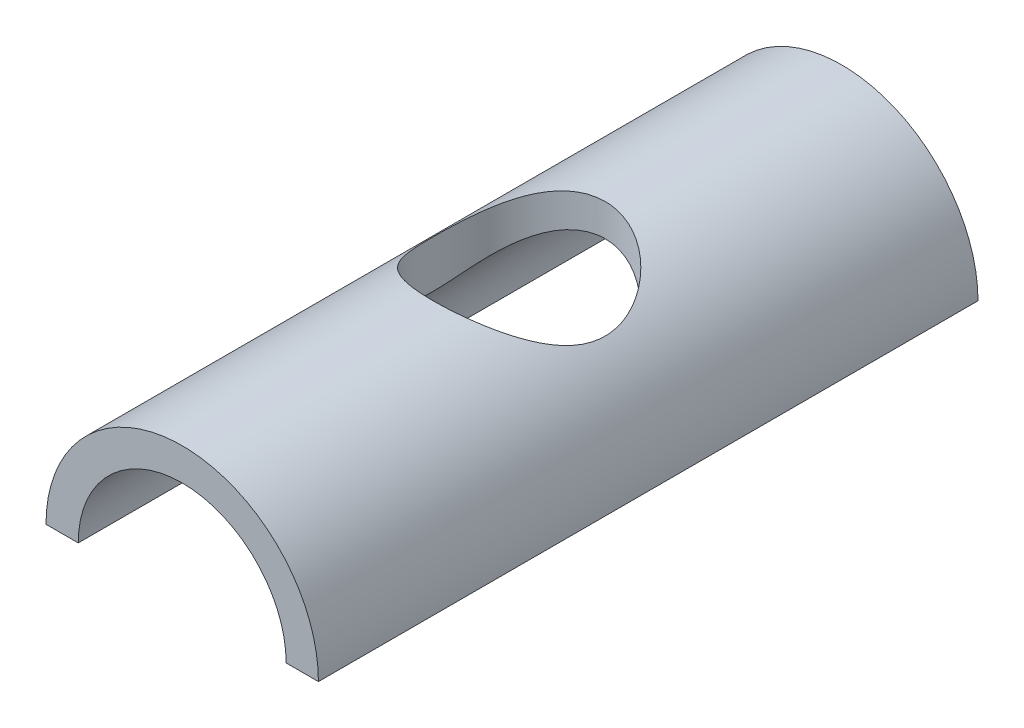
ISO-10303-21;
HEADER;
FILE_DESCRIPTION(('STEP AP214'),'2;1');
FILE_NAME('part.step','',(''),(''),'','','');
FILE_SCHEMA(('AUTOMOTIVE_DESIGN { 1 0 10303 214 1 1 1 1 }'));
ENDSEC;
DATA;
#1=APPLICATION_CONTEXT('core data for automotive mechanical design processes');
#2=APPLICATION_PROTOCOL_DEFINITION('international standard','automotive_design',2000,#1);
#3=PRODUCT_CONTEXT('',#1,'mechanical');
#4=PRODUCT('Part','Part','',(#3));
#5=PRODUCT_RELATED_PRODUCT_CATEGORY('part','',(#4));
#6=PRODUCT_DEFINITION_FORMATION('','',#4);
#7=PRODUCT_DEFINITION_CONTEXT('part definition',#1,'design');
#8=PRODUCT_DEFINITION('design','',#6,#7);
#9=PRODUCT_DEFINITION_SHAPE('','',#8);
#10=(LENGTH_UNIT() NAMED_UNIT(*) SI_UNIT(.MILLI.,.METRE.));
#11=(NAMED_UNIT(*) PLANE_ANGLE_UNIT() SI_UNIT($,.RADIAN.));
#12=(NAMED_UNIT(*) SI_UNIT($,.STERADIAN.) SOLID_ANGLE_UNIT());
#13=UNCERTAINTY_MEASURE_WITH_UNIT(LENGTH_MEASURE(1.E-05),#10,'distance_accuracy_value','');
#14=(GEOMETRIC_REPRESENTATION_CONTEXT(3) GLOBAL_UNCERTAINTY_ASSIGNED_CONTEXT((#13)) GLOBAL_UNIT_ASSIGNED_CONTEXT((#10,
#11,#12)) REPRESENTATION_CONTEXT('',''));
#15=CARTESIAN_POINT('',(0.,0.,0.));
#16=DIRECTION('',(0.,0.,1.));
#17=DIRECTION('',(1.,0.,0.));
#18=AXIS2_PLACEMENT_3D('',#15,#16,#17);
#19=CARTESIAN_POINT('',(0.,0.,46.));
#20=DIRECTION('',(0.,0.,-1.));
#21=DIRECTION('',(-1.,0.,0.));
#22=AXIS2_PLACEMENT_3D('',#19,#20,#21);
#23=CYLINDRICAL_SURFACE('',#22,7.25);
#24=CARTESIAN_POINT('',(0.,0.,0.));
#25=DIRECTION('',(0.,0.,-1.));
#26=DIRECTION('',(1.,0.,0.));
#27=AXIS2_PLACEMENT_3D('',#24,#25,#26);
#28=CIRCLE('',#27,7.25);
#29=CARTESIAN_POINT('',(-7.25,0.,0.));
#30=VERTEX_POINT('',#29);
#31=CARTESIAN_POINT('',(7.25,0.,0.));
#32=VERTEX_POINT('',#31);
#33=EDGE_CURVE('E104',#30,#32,#28,.T.);
#34=ORIENTED_EDGE('',*,*,#33,.T.);
#35=DIRECTION('',(0.,0.,-1.));
#36=VECTOR('',#35,1.);
#37=CARTESIAN_POINT('',(7.25,0.,46.));
#38=LINE('',#37,#36);
#39=CARTESIAN_POINT('',(7.25,0.,46.));
#40=VERTEX_POINT('',#39);
#41=EDGE_CURVE('E11',#40,#32,#38,.T.);
#42=ORIENTED_EDGE('',*,*,#41,.F.);
#43=CARTESIAN_POINT('',(0.,0.,46.));
#44=DIRECTION('',(0.,0.,-1.));
#45=DIRECTION('',(1.,0.,0.));
#46=AXIS2_PLACEMENT_3D('',#43,#44,#45);
#47=CIRCLE('',#46,7.25);
#48=CARTESIAN_POINT('',(-7.25,0.,46.));
#49=VERTEX_POINT('',#48);
#50=EDGE_CURVE('E90',#49,#40,#47,.T.);
#51=ORIENTED_EDGE('',*,*,#50,.F.);
#52=DIRECTION('',(0.,0.,-1.));
#53=VECTOR('',#52,1.);
#54=CARTESIAN_POINT('',(-7.25,0.,46.));
#55=LINE('',#54,#53);
#56=EDGE_CURVE('E100',#49,#30,#55,.T.);
#57=ORIENTED_EDGE('',*,*,#56,.T.);
#58=EDGE_LOOP('',(#34,#42,#51,#57));
#59=FACE_BOUND('',#58,.T.);
#60=CARTESIAN_POINT('',(0.,7.25000000000001,16.5));
#61=CARTESIAN_POINT('',(0.142794907219309,7.25000294307049,16.4999970011492));
#62=CARTESIAN_POINT('',(0.285560513284474,7.24577461504276,16.5051037722168));
#63=CARTESIAN_POINT('',(0.569923491512396,7.22896707908606,16.5254289417004));
#64=CARTESIAN_POINT('',(0.711520546177624,7.21638567263639,16.5406500021868));
#65=CARTESIAN_POINT('',(0.992444124498384,7.18314572496627,16.5809450353406));
#66=CARTESIAN_POINT('',(1.1317688212589,7.16248098919067,16.6060265645256));
#67=CARTESIAN_POINT('',(1.40707325856606,7.11352268485923,16.6656197189015));
#68=CARTESIAN_POINT('',(1.54305146346756,7.08522568268542,16.7001355885247));
#69=CARTESIAN_POINT('',(1.80984306531895,7.02179736193545,16.7777943201452));
#70=CARTESIAN_POINT('',(1.9406848932974,6.98671295450233,16.820878019664));
#71=CARTESIAN_POINT('',(2.19750721614162,6.91024232689923,16.9152254037257));
#72=CARTESIAN_POINT('',(2.32348556053077,6.86885335816671,16.9664926564739));
#73=CARTESIAN_POINT('',(2.69324442383707,6.73627033083415,17.1316492812857));
#74=CARTESIAN_POINT('',(2.9290568973433,6.63660902289273,17.2569554058607));
#75=CARTESIAN_POINT('',(3.30527923983956,6.45495845722035,17.489269483862));
#76=CARTESIAN_POINT('',(3.45222274453993,6.37739247639391,17.589472029306));
#77=CARTESIAN_POINT('',(3.73462159167594,6.21622767385335,17.8006752929014));
#78=CARTESIAN_POINT('',(3.87007713631538,6.13262895837156,17.9116758209195));
#79=CARTESIAN_POINT('',(4.1296663876781,5.9609273348714,18.1438228574984));
#80=CARTESIAN_POINT('',(4.25376821433977,5.87281276624517,18.2649962071789));
#81=CARTESIAN_POINT('',(4.49020939386879,5.69407340035859,18.5165577360546));
#82=CARTESIAN_POINT('',(4.60255020453378,5.6034489159716,18.6469447698344));
#83=CARTESIAN_POINT('',(4.81736943709263,5.41994076452731,18.9190035986399));
#84=CARTESIAN_POINT('',(4.91963493747411,5.32704572280339,19.0608357991289));
#85=CARTESIAN_POINT('',(5.11187916811156,5.14285039696008,19.3536706915438));
#86=CARTESIAN_POINT('',(5.20185379926576,5.0515506536955,19.5046764187736));
#87=CARTESIAN_POINT('',(5.36894352453074,4.87358128949922,19.8156894235393));
#88=CARTESIAN_POINT('',(5.44608975948297,4.78690081384825,19.975673603509));
#89=CARTESIAN_POINT('',(5.58704839739933,4.62159866414672,20.3052308916291));
#90=CARTESIAN_POINT('',(5.65087222980053,4.54297011201253,20.4747956204812));
#91=CARTESIAN_POINT('',(5.76997492366783,4.39091705715482,20.8421905047063));
#92=CARTESIAN_POINT('',(5.82369474194907,4.31886452186471,21.0411325314577));
#93=CARTESIAN_POINT('',(5.889245827118,4.22855517734237,21.3477433974651));
#94=CARTESIAN_POINT('',(5.90858336890369,4.20142605004214,21.4512402334435));
#95=CARTESIAN_POINT('',(5.94194245848636,4.15411328772341,21.6606290433749));
#96=CARTESIAN_POINT('',(5.95596678737267,4.1339260196474,21.7665197334711));
#97=CARTESIAN_POINT('',(5.97853364458282,4.10122422933912,21.9814015704439));
#98=CARTESIAN_POINT('',(5.9870077072378,4.08880561872641,22.0904147370007));
#99=CARTESIAN_POINT('',(5.99797295167566,4.07270396167932,22.3093864574212));
#100=CARTESIAN_POINT('',(6.00046463603913,4.0690201814307,22.4193449310906));
#101=CARTESIAN_POINT('',(5.9993926158273,4.07060056739843,22.6391865568844));
#102=CARTESIAN_POINT('',(5.9958278654552,4.07586627897121,22.749069692722));
#103=CARTESIAN_POINT('',(5.98274535307967,4.09504454336989,22.9677173397539));
#104=CARTESIAN_POINT('',(5.9732268324475,4.10895819811432,23.0764817065994));
#105=CARTESIAN_POINT('',(5.94727629612498,4.14644057480787,23.3025458073524));
#106=CARTESIAN_POINT('',(5.93026056238181,4.17081858816861,23.4196434530612));
#107=CARTESIAN_POINT('',(5.88979007518596,4.22777670784383,23.6507195474228));
#108=CARTESIAN_POINT('',(5.8663307040542,4.26036269481234,23.7646956944676));
#109=CARTESIAN_POINT('',(5.78686263934216,4.36836987730036,24.1017437255455));
#110=CARTESIAN_POINT('',(5.72181876108843,4.45395521723485,24.3194833464426));
#111=CARTESIAN_POINT('',(5.58691462906194,4.62146110514997,24.6948374370364));
#112=CARTESIAN_POINT('',(5.52102738133079,4.70028322186784,24.8553838032628));
#113=CARTESIAN_POINT('',(5.37709008025812,4.86428868883377,25.1676666423427));
#114=CARTESIAN_POINT('',(5.29903316322641,4.9494756146259,25.3193980768813));
#115=CARTESIAN_POINT('',(5.13119048116541,5.12328144545739,25.6144400404513));
#116=CARTESIAN_POINT('',(5.04138927273291,5.21190475936464,25.7577391149824));
#117=CARTESIAN_POINT('',(4.85038989644595,5.39010943006203,26.0358390934517));
#118=CARTESIAN_POINT('',(4.74919394305476,5.47969059765005,26.1706416406959));
#119=CARTESIAN_POINT('',(4.53044911262027,5.66204480584741,26.4377936447494));
#120=CARTESIAN_POINT('',(4.41235537542636,5.7547701212834,26.5697304371424));
#121=CARTESIAN_POINT('',(4.16374710634584,5.93712733918325,26.8237471628069));
#122=CARTESIAN_POINT('',(4.03323071252882,6.02675877517882,26.9458256134077));
#123=CARTESIAN_POINT('',(3.76011124224012,6.20082566587056,27.1790755545607));
#124=CARTESIAN_POINT('',(3.61753254819215,6.28527103382954,27.2902681119387));
#125=CARTESIAN_POINT('',(3.32028036446648,6.44723665334579,27.5008887148604));
#126=CARTESIAN_POINT('',(3.16561132035696,6.52475942805639,27.6003210511039));
#127=CARTESIAN_POINT('',(2.88575412835175,6.65222838738494,27.7622668158398));
#128=CARTESIAN_POINT('',(2.76315650161921,6.70415334424071,27.8277147380705));
#129=CARTESIAN_POINT('',(2.51186919229084,6.80229341030455,27.9506944178697));
#130=CARTESIAN_POINT('',(2.38318098150162,6.84850988933583,28.0082280749469));
#131=CARTESIAN_POINT('',(2.12020181480439,6.93443404114119,28.1147006487041));
#132=CARTESIAN_POINT('',(1.98591156475637,6.97414253083648,28.1636406441663));
#133=CARTESIAN_POINT('',(1.71245903428013,7.04627311640666,28.252227913297));
#134=CARTESIAN_POINT('',(1.57329919602248,7.07869880585775,28.2918797704587));
#135=CARTESIAN_POINT('',(1.28986329626486,7.13581144443918,28.3615446912051));
#136=CARTESIAN_POINT('',(1.14555660928916,7.16043830733639,28.3914829575416));
#137=CARTESIAN_POINT('',(0.853934464569178,7.20103917395386,28.4407626216202));
#138=CARTESIAN_POINT('',(0.706619003341277,7.21701316765509,28.4601040070925));
#139=CARTESIAN_POINT('',(0.41032075829055,7.23990370963764,28.4878014825216));
#140=CARTESIAN_POINT('',(0.261338729891754,7.24682420628183,28.4961623612447));
#141=CARTESIAN_POINT('',(-0.0369693893814371,7.25143977255814,28.5017398887338));
#142=CARTESIAN_POINT('',(-0.18629544598704,7.24913572444478,28.4989576032549));
#143=CARTESIAN_POINT('',(-0.467119805203322,7.23614395394476,28.4832512090834));
#144=CARTESIAN_POINT('',(-0.598731790334349,7.2264297011182,28.471504654499));
#145=CARTESIAN_POINT('',(-0.860241375050885,7.19998348111864,28.4394733617939));
#146=CARTESIAN_POINT('',(-0.990138397589092,7.18324921096307,28.419185821715));
#147=CARTESIAN_POINT('',(-1.2472810793257,7.14308856572792,28.370383894376));
#148=CARTESIAN_POINT('',(-1.37452752418311,7.11966420484047,28.3418719832097));
#149=CARTESIAN_POINT('',(-1.62569245341891,7.06655023411578,28.2770212560408));
#150=CARTESIAN_POINT('',(-1.74960965298127,7.03685824355244,28.2406794657911));
#151=CARTESIAN_POINT('',(-2.12094617777228,6.93762003159037,28.1187511653766));
#152=CARTESIAN_POINT('',(-2.36216393746343,6.85884080398107,28.0213783598909));
#153=CARTESIAN_POINT('',(-2.82417477936797,6.68190846734848,27.799984347027));
#154=CARTESIAN_POINT('',(-3.04496092185272,6.58374881085456,27.6759541324703));
#155=CARTESIAN_POINT('',(-3.40697573478949,6.40188237956942,27.4422062177174));
#156=CARTESIAN_POINT('',(-3.55344910928525,6.32156431861596,27.3378504386004));
#157=CARTESIAN_POINT('',(-3.83448747456273,6.15514971323948,27.1182794798088));
#158=CARTESIAN_POINT('',(-3.9690520631839,6.06905297384261,27.0030639336701));
#159=CARTESIAN_POINT('',(-4.22657914363382,5.89262037945056,26.7623014054474));
#160=CARTESIAN_POINT('',(-4.34950133845351,5.80227131312427,26.6367211673583));
#161=CARTESIAN_POINT('',(-4.58320461296234,5.61949581764139,26.3761911861721));
#162=CARTESIAN_POINT('',(-4.69398748055597,5.52706969682052,26.241242827626));
#163=CARTESIAN_POINT('',(-4.90522866992029,5.34054526766151,25.9598028498748));
#164=CARTESIAN_POINT('',(-5.00547189375194,5.2464460556797,25.813150315915));
#165=CARTESIAN_POINT('',(-5.19322861774342,5.06066352434224,25.5103382699212));
#166=CARTESIAN_POINT('',(-5.28073688602393,4.96898121051151,25.354174887725));
#167=CARTESIAN_POINT('',(-5.44226452147899,4.79151268345653,25.0325904915805));
#168=CARTESIAN_POINT('',(-5.51632861672603,4.70570753347568,24.8672026607302));
#169=CARTESIAN_POINT('',(-5.65040220736705,4.54383963024039,24.5264430552263));
#170=CARTESIAN_POINT('',(-5.71042682275843,4.46776643642202,24.3510822765471));
#171=CARTESIAN_POINT('',(-5.81818260740706,4.32661777347401,23.9792738717478));
#172=CARTESIAN_POINT('',(-5.86498995860723,4.26244522183518,23.782192816399));
#173=CARTESIAN_POINT('',(-5.92041930620088,4.18475187044475,23.4793691526929));
#174=CARTESIAN_POINT('',(-5.93642567770103,4.16195846497506,23.3773066568856));
#175=CARTESIAN_POINT('',(-5.96324318337974,4.12344321555397,23.1712026299394));
#176=CARTESIAN_POINT('',(-5.97405685612923,4.1077179164363,23.0671620917276));
#177=CARTESIAN_POINT('',(-5.99032329803296,4.0839612528838,22.8567472933483));
#178=CARTESIAN_POINT('',(-5.9957228884398,4.07600622970696,22.7503601762523));
#179=CARTESIAN_POINT('',(-6.00083227757223,4.06848050511636,22.5371535609556));
#180=CARTESIAN_POINT('',(-6.00054238295511,4.06890935182077,22.4303340863689));
#181=CARTESIAN_POINT('',(-5.99427911834389,4.07813042656368,22.2171646265988));
#182=CARTESIAN_POINT('',(-5.98830229078206,4.08692774250189,22.110814966576));
#183=CARTESIAN_POINT('',(-5.97081572592041,4.11243176213667,21.8994899933561));
#184=CARTESIAN_POINT('',(-5.95930298662604,4.12914275716039,21.794515457621));
#185=CARTESIAN_POINT('',(-5.92852024090685,4.17324710740221,21.5684145356899));
#186=CARTESIAN_POINT('',(-5.90824245981755,4.20200177052656,21.4476921520504));
#187=CARTESIAN_POINT('',(-5.86090397093303,4.26777935381757,21.2098321659675));
#188=CARTESIAN_POINT('',(-5.83383795136845,4.30480874644178,21.0926974517836));
#189=CARTESIAN_POINT('',(-5.77335443126994,4.38559314233372,20.8621284807538));
#190=CARTESIAN_POINT('',(-5.73992072337708,4.42936525193115,20.7487045512687));
#191=CARTESIAN_POINT('',(-5.66718555881699,4.52205509754402,20.5259865664676));
#192=CARTESIAN_POINT('',(-5.62788552293325,4.57097158678157,20.4166915191746));
#193=CARTESIAN_POINT('',(-5.51973518480818,4.70167345635123,20.1409118997303));
#194=CARTESIAN_POINT('',(-5.44681416986517,4.78629459666773,19.9773585122971));
#195=CARTESIAN_POINT('',(-5.28811917674402,4.96107459345617,19.6596939705169));
#196=CARTESIAN_POINT('',(-5.20233826381301,5.0512364221921,19.5055879742768));
#197=CARTESIAN_POINT('',(-5.01824867118968,5.23417084938289,19.2063596460004));
#198=CARTESIAN_POINT('',(-4.9199242193533,5.326946618139,19.0612489719552));
#199=CARTESIAN_POINT('',(-4.7110360222484,5.51254621255908,18.7802173214664));
#200=CARTESIAN_POINT('',(-4.6004746484338,5.60537002545394,18.6442945726444));
#201=CARTESIAN_POINT('',(-4.36294522968875,5.79231099874003,18.377162728448));
#202=CARTESIAN_POINT('',(-4.23553046545872,5.88635482321544,18.2462983950565));
#203=CARTESIAN_POINT('',(-3.9675895250322,6.07018407503689,17.9953443149197));
#204=CARTESIAN_POINT('',(-3.82706109821587,6.15996876741045,17.8752564246342));
#205=CARTESIAN_POINT('',(-3.53335014732211,6.3330031136218,17.6471728702185));
#206=CARTESIAN_POINT('',(-3.38019618884458,6.41626673146288,17.5391511439675));
#207=CARTESIAN_POINT('',(-3.06134536010217,6.57436614399756,17.3362973840713));
#208=CARTESIAN_POINT('',(-2.89565474168591,6.6492060937307,17.2414588422451));
#209=CARTESIAN_POINT('',(-2.60345055926688,6.76768071365311,17.0925623355373));
#210=CARTESIAN_POINT('',(-2.47991259122163,6.81398273893659,17.0347570439009));
#211=CARTESIAN_POINT('',(-2.22742490304096,6.9006435308656,16.9270830677988));
#212=CARTESIAN_POINT('',(-2.09847655457198,6.94100379233656,16.8772123868925));
#213=CARTESIAN_POINT('',(-1.83591270520722,7.01501932348782,16.7860958024169));
#214=CARTESIAN_POINT('',(-1.7023044225851,7.04868446523983,16.7448371956714));
#215=CARTESIAN_POINT('',(-1.43103959948199,7.10872190867886,16.6714606656843));
#216=CARTESIAN_POINT('',(-1.29338408183325,7.1350960357458,16.6393404544934));
#217=CARTESIAN_POINT('',(-0.96577006351977,7.18791576237162,16.5751302350919));
#218=CARTESIAN_POINT('',(-0.774473637518068,7.21111175857059,16.5470391302339));
#219=CARTESIAN_POINT('',(-0.388767095924693,7.24215330480034,16.5094743188301));
#220=CARTESIAN_POINT('',(-0.194356406889082,7.24999599422266,16.5000040816992));
#221=CARTESIAN_POINT('',(0.,7.25000000000001,16.5));
#222=B_SPLINE_CURVE_WITH_KNOTS('',3,(#60,#61,#62,#63,#64,#65,#66,#67,#68,#69,#70,#71,#72,#73,
#74,#75,#76,#77,#78,#79,#80,#81,#82,#83,#84,#85,#86,#87,#88,#89,#90,#91,#92,#93,#94,#95,#96,#97,
#98,#99,#100,#101,#102,#103,#104,#105,#106,#107,#108,#109,#110,#111,#112,#113,#114,#115,#116,
#117,#118,#119,#120,#121,#122,#123,#124,#125,#126,#127,#128,#129,#130,#131,#132,#133,#134,#135,
#136,#137,#138,#139,#140,#141,#142,#143,#144,#145,#146,#147,#148,#149,#150,#151,#152,#153,#154,
#155,#156,#157,#158,#159,#160,#161,#162,#163,#164,#165,#166,#167,#168,#169,#170,#171,#172,#173,
#174,#175,#176,#177,#178,#179,#180,#181,#182,#183,#184,#185,#186,#187,#188,#189,#190,#191,#192,
#193,#194,#195,#196,#197,#198,#199,#200,#201,#202,#203,#204,#205,#206,#207,#208,#209,#210,#211,
#212,#213,#214,#215,#216,#217,#218,#219,#220,#221),.UNSPECIFIED.,.T.,.F.,(4,2,2,2,2,2,2,2,2,2,2,
2,2,2,2,2,2,2,2,2,2,2,2,2,2,2,2,2,2,2,2,2,2,2,2,2,2,2,2,2,2,2,2,2,2,2,2,2,2,2,2,2,2,2,2,2,2,2,2,
2,2,2,2,2,2,2,2,2,2,2,2,2,2,2,2,2,2,2,2,2,4),(0.,0.428181851713375,0.856476445101764,
1.28509990157768,1.71391651052177,2.13986890816286,2.56600754008366,3.41762273561725,
3.99908044764527,4.58052792309698,5.16356091375774,5.74652155072503,6.33993353909794,
6.93354295437367,7.52568965844949,8.11732624619917,8.76995059578668,9.09582029481481,
9.42151918777894,9.75116365759201,10.0807804329494,10.4104541307744,10.7401698441447,
11.1020418187648,11.4641737999584,12.1898094850291,12.760970854087,13.3324555311722,
13.9046993955053,14.4768322408556,15.0758398294821,15.6749373402614,16.2728515322011,
16.8705468986381,17.3152173415692,17.7597808719047,18.2042885551919,18.6485764193483,
19.0962084184749,19.5438409359071,19.9912781690806,20.4386726094554,20.8356776027147,
21.2328129391662,21.629828835508,22.0269958084881,22.8390280907814,23.6513351803722,
24.2414966969494,24.8316781357238,25.4238328981582,26.0159003292937,26.6183494099232,
27.2210452991431,27.82169775245,28.4217003158414,29.0567791774527,29.3738443690092,
29.6907543977054,30.0107475851965,30.3307235254366,30.6508941305154,30.9712385527082,
31.3478870622013,31.7248312222289,32.1027479406848,32.480573278425,33.0738669248062,
33.667481665775,34.2618503088595,34.8561039673097,35.4717062425564,36.0874143649513,
36.7017657757444,37.3158128125113,37.747531655164,38.1791416999553,38.6101105310139,
39.0409713667093,39.6236559088596,40.2064490057193),.UNSPECIFIED.);
#223=CARTESIAN_POINT('',(0.,7.25000000000001,16.5));
#224=VERTEX_POINT('',#223);
#225=EDGE_CURVE('E107',#224,#224,#222,.T.);
#226=ORIENTED_EDGE('',*,*,#225,.F.);
#227=EDGE_LOOP('',(#226));
#228=FACE_BOUND('',#227,.T.);
#229=ADVANCED_FACE('F33',(#59,#228),#23,.F.);
#230=CARTESIAN_POINT('',(0.,0.,46.));
#231=DIRECTION('',(0.,0.,-1.));
#232=DIRECTION('',(-1.,0.,0.));
#233=AXIS2_PLACEMENT_3D('',#230,#231,#232);
#234=CYLINDRICAL_SURFACE('',#233,9.5);
#235=CARTESIAN_POINT('',(0.,0.,0.));
#236=DIRECTION('',(0.,0.,1.));
#237=DIRECTION('',(1.,0.,0.));
#238=AXIS2_PLACEMENT_3D('',#235,#236,#237);
#239=CIRCLE('',#238,9.5);
#240=CARTESIAN_POINT('',(9.5,0.,0.));
#241=VERTEX_POINT('',#240);
#242=CARTESIAN_POINT('',(-9.5,0.,0.));
#243=VERTEX_POINT('',#242);
#244=EDGE_CURVE('E72',#241,#243,#239,.T.);
#245=ORIENTED_EDGE('',*,*,#244,.T.);
#246=DIRECTION('',(0.,0.,-1.));
#247=VECTOR('',#246,1.);
#248=CARTESIAN_POINT('',(-9.5,0.,46.));
#249=LINE('',#248,#247);
#250=CARTESIAN_POINT('',(-9.5,0.,46.));
#251=VERTEX_POINT('',#250);
#252=EDGE_CURVE('E95',#251,#243,#249,.T.);
#253=ORIENTED_EDGE('',*,*,#252,.F.);
#254=CARTESIAN_POINT('',(0.,0.,46.));
#255=DIRECTION('',(0.,0.,1.));
#256=DIRECTION('',(1.,0.,0.));
#257=AXIS2_PLACEMENT_3D('',#254,#255,#256);
#258=CIRCLE('',#257,9.5);
#259=CARTESIAN_POINT('',(9.5,0.,46.));
#260=VERTEX_POINT('',#259);
#261=EDGE_CURVE('E88',#260,#251,#258,.T.);
#262=ORIENTED_EDGE('',*,*,#261,.F.);
#263=DIRECTION('',(0.,0.,-1.));
#264=VECTOR('',#263,1.);
#265=CARTESIAN_POINT('',(9.5,0.,46.));
#266=LINE('',#265,#264);
#267=EDGE_CURVE('E47',#260,#241,#266,.T.);
#268=ORIENTED_EDGE('',*,*,#267,.T.);
#269=EDGE_LOOP('',(#245,#253,#262,#268));
#270=FACE_BOUND('',#269,.T.);
#271=CARTESIAN_POINT('',(0.,9.50000000000001,16.5));
#272=CARTESIAN_POINT('',(-0.152217781548316,9.50000010811466,16.4999998509858));
#273=CARTESIAN_POINT('',(-0.304435133913906,9.49633375317772,16.5057998450775));
#274=CARTESIAN_POINT('',(-0.607700265590872,9.4817591177443,16.5289166640434));
#275=CARTESIAN_POINT('',(-0.758747559974482,9.47084798176806,16.5462380299904));
#276=CARTESIAN_POINT('',(-1.05862998685375,9.44203490156377,16.5921794906479));
#277=CARTESIAN_POINT('',(-1.20746204802428,9.42412404765981,16.620813985923));
#278=CARTESIAN_POINT('',(-1.50170458936936,9.3817371700556,16.6890014073692));
#279=CARTESIAN_POINT('',(-1.64711359743854,9.35725837591614,16.72855894122));
#280=CARTESIAN_POINT('',(-1.93273877473648,9.30244841928212,16.8178539480675));
#281=CARTESIAN_POINT('',(-2.07297883828465,9.27214973079128,16.867535022924));
#282=CARTESIAN_POINT('',(-2.34834513476161,9.20626725642893,16.9766640490301));
#283=CARTESIAN_POINT('',(-2.48346936209297,9.17068142417971,17.0361157829424));
#284=CARTESIAN_POINT('',(-2.88000891205133,9.05709355793007,17.2282186500697));
#285=CARTESIAN_POINT('',(-3.13290208550819,8.97219907591533,17.3747161030078));
#286=CARTESIAN_POINT('',(-3.63111253812834,8.783041283433,17.7132365291101));
#287=CARTESIAN_POINT('',(-3.87417114926361,8.6777677444423,17.9079794973478));
#288=CARTESIAN_POINT('',(-4.32647591540082,8.46135089099828,18.3313477079032));
#289=CARTESIAN_POINT('',(-4.53567528203262,8.35019973106601,18.5600190122334));
#290=CARTESIAN_POINT('',(-4.83495322370872,8.17856798024581,18.9427103244029));
#291=CARTESIAN_POINT('',(-4.93756753225086,8.116854768709,19.0865385423596));
#292=CARTESIAN_POINT('',(-5.13023418885575,7.99647413959318,19.3835787235105));
#293=CARTESIAN_POINT('',(-5.22028410768148,7.93780731238413,19.536792493118));
#294=CARTESIAN_POINT('',(-5.47021291319002,7.76961839762938,20.0093462598264));
#295=CARTESIAN_POINT('',(-5.61046898615349,7.66754741122867,20.3423585977397));
#296=CARTESIAN_POINT('',(-5.80122342879503,7.52371459912114,20.9451499631235));
#297=CARTESIAN_POINT('',(-5.86564200843056,7.47314531369213,21.2084168017748));
#298=CARTESIAN_POINT('',(-5.93526905577422,7.41777531798498,21.610546130133));
#299=CARTESIAN_POINT('',(-5.95397654045122,7.4027339258085,21.7457570205439));
#300=CARTESIAN_POINT('',(-5.98215178262781,7.37998709106471,22.0177800182282));
#301=CARTESIAN_POINT('',(-5.99161942373587,7.37228174090736,22.1545921456498));
#302=CARTESIAN_POINT('',(-6.00115878180494,7.36451814550234,22.4291494108753));
#303=CARTESIAN_POINT('',(-6.00120367456313,7.36448173179358,22.566896095997));
#304=CARTESIAN_POINT('',(-5.9918329042445,7.37210788820477,22.8418503038663));
#305=CARTESIAN_POINT('',(-5.98241719268132,7.37977049778283,22.9790578238471));
#306=CARTESIAN_POINT('',(-5.95427360370867,7.40249633888149,23.2519632288202));
#307=CARTESIAN_POINT('',(-5.93554100857926,7.41756331965145,23.3876603133585));
#308=CARTESIAN_POINT('',(-5.88905597515429,7.45452147621763,23.6565770004795));
#309=CARTESIAN_POINT('',(-5.86129979746503,7.47641548099463,23.7897955517137));
#310=CARTESIAN_POINT('',(-5.76672472271069,7.5499140931372,24.177590645769));
#311=CARTESIAN_POINT('',(-5.68779576016161,7.61002830982465,24.4277153382645));
#312=CARTESIAN_POINT('',(-5.5001951885026,7.74669199341957,24.9115079411475));
#313=CARTESIAN_POINT('',(-5.39151313566729,7.82324722930325,25.1451700366682));
#314=CARTESIAN_POINT('',(-5.12381265112992,8.00169167614828,25.6367219670166));
#315=CARTESIAN_POINT('',(-4.95915584419163,8.10563157084582,25.8907949231565));
#316=CARTESIAN_POINT('',(-4.59448521621581,8.31776462036716,26.3706059447982));
#317=CARTESIAN_POINT('',(-4.3944345347523,8.42596211696526,26.5963140469062));
#318=CARTESIAN_POINT('',(-4.05122338802716,8.59404594544381,26.9293170901346));
#319=CARTESIAN_POINT('',(-3.91871375224575,8.65542053643117,27.0470027619895));
#320=CARTESIAN_POINT('',(-3.64295430306334,8.77504636038759,27.2707854000162));
#321=CARTESIAN_POINT('',(-3.49970803913359,8.83329861475656,27.3768861678451));
#322=CARTESIAN_POINT('',(-3.20305908556742,8.94514093635477,27.5766515385239));
#323=CARTESIAN_POINT('',(-3.04965598207825,8.99873081340367,27.6703156341586));
#324=CARTESIAN_POINT('',(-2.73348427250174,9.09975776434898,27.8442118777572));
#325=CARTESIAN_POINT('',(-2.57071675723522,9.1471955527898,27.9244455859308));
#326=CARTESIAN_POINT('',(-2.2453396732803,9.23229511691582,28.0667184244387));
#327=CARTESIAN_POINT('',(-2.08314238531383,9.27033117286031,28.1294749444118));
#328=CARTESIAN_POINT('',(-1.75241725204394,9.33849690078307,28.2410343789577));
#329=CARTESIAN_POINT('',(-1.58389053884884,9.36862797905325,28.2898397755675));
#330=CARTESIAN_POINT('',(-1.24211494415772,9.42003064932873,28.3726510841819));
#331=CARTESIAN_POINT('',(-1.06887170916573,9.44131237808279,28.4066739313122));
#332=CARTESIAN_POINT('',(-0.719179275933761,9.47436560822845,28.4593647371059));
#333=CARTESIAN_POINT('',(-0.542730659316001,9.48613881767712,28.4780354535508));
#334=CARTESIAN_POINT('',(-0.215417791422851,9.49874799819143,28.4980211349106));
#335=CARTESIAN_POINT('',(-0.0647364577502499,9.50097312708863,28.5015407515504));
#336=CARTESIAN_POINT('',(0.236394541204736,9.49825142297352,28.4972314149429));
#337=CARTESIAN_POINT('',(0.38684422332542,9.49330513851709,28.4894033297043));
#338=CARTESIAN_POINT('',(0.686314964037288,9.4763635291808,28.4625140629131));
#339=CARTESIAN_POINT('',(0.835336159402212,9.46436888615403,28.4434539679364));
#340=CARTESIAN_POINT('',(1.1308498045147,9.43362340814705,28.39437153996));
#341=CARTESIAN_POINT('',(1.27734221564186,9.41487247007804,28.3643490396938));
#342=CARTESIAN_POINT('',(1.56045122408805,9.37201044436064,28.2952809316537));
#343=CARTESIAN_POINT('',(1.6972195035056,9.34816972784296,28.2566875067071));
#344=CARTESIAN_POINT('',(1.9667689074856,9.29519876994354,28.1702626086551));
#345=CARTESIAN_POINT('',(2.09954875027884,9.26606684887349,28.1224282017001));
#346=CARTESIAN_POINT('',(2.49080088319174,9.17157110942251,27.9657767352011));
#347=CARTESIAN_POINT('',(2.74240265070122,9.0990731727119,27.8437576829149));
#348=CARTESIAN_POINT('',(3.24686905935965,8.93226861556431,27.5547718200623));
#349=CARTESIAN_POINT('',(3.4973556106195,8.83650784664112,27.3845353117186));
#350=CARTESIAN_POINT('',(3.96795116411569,8.63544667840478,27.0106333905942));
#351=CARTESIAN_POINT('',(4.18802667078657,8.53013596858869,26.8069316501698));
#352=CARTESIAN_POINT('',(4.62550427743059,8.30205991123612,26.3370025014709));
#353=CARTESIAN_POINT('',(4.837642055111,8.17902776783214,26.0659817005691));
#354=CARTESIAN_POINT('',(5.2143091090405,7.94419392634683,25.4882747690905));
#355=CARTESIAN_POINT('',(5.37886609855787,7.83238571580041,25.1816095460175));
#356=CARTESIAN_POINT('',(5.62612217176122,7.65604126720394,24.6033235029256));
#357=CARTESIAN_POINT('',(5.71870492184535,7.58651135423103,24.3375237796733));
#358=CARTESIAN_POINT('',(5.82942627474268,7.50132816349523,23.927538188042));
#359=CARTESIAN_POINT('',(5.8616372580172,7.47612250267044,23.789027141566));
#360=CARTESIAN_POINT('',(5.91626859893119,7.43296645773306,23.5090010675404));
#361=CARTESIAN_POINT('',(5.93869326428868,7.41501288167464,23.3674873905048));
#362=CARTESIAN_POINT('',(5.9735049863379,7.38699822790433,23.0814894139566));
#363=CARTESIAN_POINT('',(5.98582455782322,7.37699022741665,22.9369916450013));
#364=CARTESIAN_POINT('',(5.99994996931948,7.36550647421993,22.6471393202535));
#365=CARTESIAN_POINT('',(6.00175588303044,7.36403066170082,22.5017847704742));
#366=CARTESIAN_POINT('',(5.99481756141355,7.36967985505217,22.2114651746663));
#367=CARTESIAN_POINT('',(5.98607087192677,7.37680686163155,22.0665002271046));
#368=CARTESIAN_POINT('',(5.95818979232268,7.39934409852641,21.7782347883833));
#369=CARTESIAN_POINT('',(5.93905561473833,7.41475415936658,21.6349342632301));
#370=CARTESIAN_POINT('',(5.89291479463271,7.45146544626186,21.3639050102117));
#371=CARTESIAN_POINT('',(5.86677407354205,7.47210979851286,21.235937740003));
#372=CARTESIAN_POINT('',(5.80650086277785,7.5190426676256,20.9829379779936));
#373=CARTESIAN_POINT('',(5.77236572613699,7.54533305366079,20.85790647335));
#374=CARTESIAN_POINT('',(5.65850486598068,7.63154021490882,20.4880884629618));
#375=CARTESIAN_POINT('',(5.56730227411289,7.69881089530236,20.2484553376071));
#376=CARTESIAN_POINT('',(5.34240603062984,7.856849654762,19.7535861885176));
#377=CARTESIAN_POINT('',(5.20453373791399,7.94959362065025,19.5009161635095));
#378=CARTESIAN_POINT('',(4.89587520243419,8.14331597406099,19.0197521401795));
#379=CARTESIAN_POINT('',(4.72506296955779,8.24430082723394,18.791277454336));
#380=CARTESIAN_POINT('',(4.42678450077854,8.40654417506421,18.4462257615566));
#381=CARTESIAN_POINT('',(4.30892491768829,8.46770458146916,18.3211549290603));
#382=CARTESIAN_POINT('',(4.06255402911104,8.58862387033581,18.0812674904901));
#383=CARTESIAN_POINT('',(3.93404575092341,8.648383144967,17.9664479892352));
#384=CARTESIAN_POINT('',(3.6667137386389,8.76507300845735,17.7476242053373));
#385=CARTESIAN_POINT('',(3.52788093805247,8.82200103608065,17.6436296255593));
#386=CARTESIAN_POINT('',(3.24052513096882,8.93155295416641,17.4473502773805));
#387=CARTESIAN_POINT('',(3.09200106018832,8.98417637046684,17.3550667983664));
#388=CARTESIAN_POINT('',(2.78415092331596,9.08432775783591,17.1821017425949));
#389=CARTESIAN_POINT('',(2.6247170796758,9.13178740824612,17.1015718028667));
#390=CARTESIAN_POINT('',(2.29771573176374,9.21949743063767,16.9544958491546));
#391=CARTESIAN_POINT('',(2.13015296329752,9.25975193762892,16.88794181062));
#392=CARTESIAN_POINT('',(1.7885237300104,9.33175077743509,16.7699255320585));
#393=CARTESIAN_POINT('',(1.61447565484702,9.36351735499997,16.7184238097081));
#394=CARTESIAN_POINT('',(1.26113365006359,9.41761336639785,16.6312169182552));
#395=CARTESIAN_POINT('',(1.08184354738144,9.43994950962494,16.5955005176494));
#396=CARTESIAN_POINT('',(0.752269492571099,9.47134555408681,16.5454481311363));
#397=CARTESIAN_POINT('',(0.602544906802139,9.48206725396049,16.5284277739396));
#398=CARTESIAN_POINT('',(0.301880119446235,9.49639462713497,16.5057034581222));
#399=CARTESIAN_POINT('',(0.150939848719801,9.49999989279302,16.5000001477631));
#400=CARTESIAN_POINT('',(0.,9.50000000000001,16.5));
#401=B_SPLINE_CURVE_WITH_KNOTS('',3,(#271,#272,#273,#274,#275,#276,#277,#278,#279,#280,#281,
#282,#283,#284,#285,#286,#287,#288,#289,#290,#291,#292,#293,#294,#295,#296,#297,#298,#299,#300,
#301,#302,#303,#304,#305,#306,#307,#308,#309,#310,#311,#312,#313,#314,#315,#316,#317,#318,#319,
#320,#321,#322,#323,#324,#325,#326,#327,#328,#329,#330,#331,#332,#333,#334,#335,#336,#337,#338,
#339,#340,#341,#342,#343,#344,#345,#346,#347,#348,#349,#350,#351,#352,#353,#354,#355,#356,#357,
#358,#359,#360,#361,#362,#363,#364,#365,#366,#367,#368,#369,#370,#371,#372,#373,#374,#375,#376,
#377,#378,#379,#380,#381,#382,#383,#384,#385,#386,#387,#388,#389,#390,#391,#392,#393,#394,#395,
#396,#397,#398,#399,#400),.UNSPECIFIED.,.T.,.F.,(4,2,2,2,2,2,2,2,2,2,2,2,2,2,2,2,2,2,2,2,2,2,2,
2,2,2,2,2,2,2,2,2,2,2,2,2,2,2,2,2,2,2,2,2,2,2,2,2,2,2,2,2,2,2,2,2,2,2,2,2,2,2,2,2,4),(0.,
0.456499352671182,0.913178738258074,1.37044131698839,1.82789707883824,2.28287080826063,
2.73802109526518,3.64733643226729,4.63003970053974,5.61408953190026,6.17491307371534,
6.73584489703632,7.85465230843106,8.67813277368017,9.08965332035894,9.5011790507722,
9.91387627595142,10.3265756162478,10.7394841450748,11.1525640027397,11.9565346264183,
12.7607878169827,13.7176614507615,14.6755375360567,15.2375983248832,15.7994741121421,
16.3613728078176,16.923206182289,17.4564895027066,17.9896778878359,18.5222538228085,
19.0547340675366,19.5063709423926,19.9579732724558,20.4095319220279,20.8610974618571,
21.2929086786837,21.7248572139569,22.5880835326212,23.5374274058258,24.487808717284,
25.5795193374335,26.6705928076352,27.536587597242,27.9693939644627,28.4020096273814,
28.8374914451032,29.2729702101232,29.7085502714894,30.1441214210152,30.5403983350303,
30.9368066431038,31.7292483677123,32.6334527490147,33.5383735020696,34.0850876459717,
34.6316468951916,35.178691906194,35.7257970944418,36.2794328976892,36.8327499451121,
37.3846023378694,37.9360614443875,38.3887023640302,38.8413692110438),.UNSPECIFIED.);
#402=CARTESIAN_POINT('',(0.,9.50000000000001,16.5));
#403=VERTEX_POINT('',#402);
#404=EDGE_CURVE('E37',#403,#403,#401,.T.);
#405=ORIENTED_EDGE('',*,*,#404,.F.);
#406=EDGE_LOOP('',(#405));
#407=FACE_BOUND('',#406,.T.);
#408=ADVANCED_FACE('F97',(#270,#407),#234,.T.);
#409=CARTESIAN_POINT('',(7.25,0.,46.));
#410=DIRECTION('',(0.,1.,0.));
#411=DIRECTION('',(0.,0.,1.));
#412=AXIS2_PLACEMENT_3D('',#409,#410,#411);
#413=PLANE('',#412);
#414=DIRECTION('',(1.,0.,0.));
#415=VECTOR('',#414,1.);
#416=CARTESIAN_POINT('',(7.25,0.,0.));
#417=LINE('',#416,#415);
#418=EDGE_CURVE('E94',#32,#241,#417,.T.);
#419=ORIENTED_EDGE('',*,*,#418,.T.);
#420=ORIENTED_EDGE('',*,*,#267,.F.);
#421=DIRECTION('',(1.,0.,0.));
#422=VECTOR('',#421,1.);
#423=CARTESIAN_POINT('',(7.25,0.,46.));
#424=LINE('',#423,#422);
#425=EDGE_CURVE('E85',#40,#260,#424,.T.);
#426=ORIENTED_EDGE('',*,*,#425,.F.);
#427=ORIENTED_EDGE('',*,*,#41,.T.);
#428=EDGE_LOOP('',(#419,#420,#426,#427));
#429=FACE_BOUND('',#428,.T.);
#430=ADVANCED_FACE('F93',(#429),#413,.F.);
#431=CARTESIAN_POINT('',(-9.5,0.,46.));
#432=DIRECTION('',(0.,1.,0.));
#433=DIRECTION('',(0.,0.,1.));
#434=AXIS2_PLACEMENT_3D('',#431,#432,#433);
#435=PLANE('',#434);
#436=DIRECTION('',(1.,0.,0.));
#437=VECTOR('',#436,1.);
#438=CARTESIAN_POINT('',(-9.5,0.,0.));
#439=LINE('',#438,#437);
#440=EDGE_CURVE('E78',#243,#30,#439,.T.);
#441=ORIENTED_EDGE('',*,*,#440,.T.);
#442=ORIENTED_EDGE('',*,*,#56,.F.);
#443=DIRECTION('',(1.,0.,0.));
#444=VECTOR('',#443,1.);
#445=CARTESIAN_POINT('',(-9.5,0.,46.));
#446=LINE('',#445,#444);
#447=EDGE_CURVE('E55',#251,#49,#446,.T.);
#448=ORIENTED_EDGE('',*,*,#447,.F.);
#449=ORIENTED_EDGE('',*,*,#252,.T.);
#450=EDGE_LOOP('',(#441,#442,#448,#449));
#451=FACE_BOUND('',#450,.T.);
#452=ADVANCED_FACE('F112',(#451),#435,.F.);
#453=CARTESIAN_POINT('',(0.,0.,46.));
#454=DIRECTION('',(0.,0.,1.));
#455=DIRECTION('',(1.,0.,0.));
#456=AXIS2_PLACEMENT_3D('',#453,#454,#455);
#457=PLANE('',#456);
#458=ORIENTED_EDGE('',*,*,#50,.T.);
#459=ORIENTED_EDGE('',*,*,#425,.T.);
#460=ORIENTED_EDGE('',*,*,#261,.T.);
#461=ORIENTED_EDGE('',*,*,#447,.T.);
#462=EDGE_LOOP('',(#458,#459,#460,#461));
#463=FACE_BOUND('',#462,.T.);
#464=ADVANCED_FACE('F86',(#463),#457,.T.);
#465=CARTESIAN_POINT('',(0.,0.,0.));
#466=DIRECTION('',(0.,0.,1.));
#467=DIRECTION('',(1.,0.,0.));
#468=AXIS2_PLACEMENT_3D('',#465,#466,#467);
#469=PLANE('',#468);
#470=ORIENTED_EDGE('',*,*,#33,.F.);
#471=ORIENTED_EDGE('',*,*,#440,.F.);
#472=ORIENTED_EDGE('',*,*,#244,.F.);
#473=ORIENTED_EDGE('',*,*,#418,.F.);
#474=EDGE_LOOP('',(#470,#471,#472,#473));
#475=FACE_BOUND('',#474,.T.);
#476=ADVANCED_FACE('F115',(#475),#469,.F.);
#477=CARTESIAN_POINT('',(0.,45.,22.5));
#478=DIRECTION('',(0.,-1.,0.));
#479=DIRECTION('',(0.,0.,-1.));
#480=AXIS2_PLACEMENT_3D('',#477,#478,#479);
#481=CYLINDRICAL_SURFACE('',#480,6.);
#482=ORIENTED_EDGE('',*,*,#404,.T.);
#483=EDGE_LOOP('',(#482));
#484=FACE_BOUND('',#483,.T.);
#485=ORIENTED_EDGE('',*,*,#225,.T.);
#486=EDGE_LOOP('',(#485));
#487=FACE_BOUND('',#486,.T.);
#488=ADVANCED_FACE('F122',(#484,#487),#481,.F.);
#489=CLOSED_SHELL('',(#229,#408,#430,#452,#464,#476,#488));
#490=MANIFOLD_SOLID_BREP('B2',#489);
#491=ADVANCED_BREP_SHAPE_REPRESENTATION('',(#18,#490),#14);
#492=SHAPE_DEFINITION_REPRESENTATION(#9,#491);
ENDSEC;
END-ISO-10303-21;
